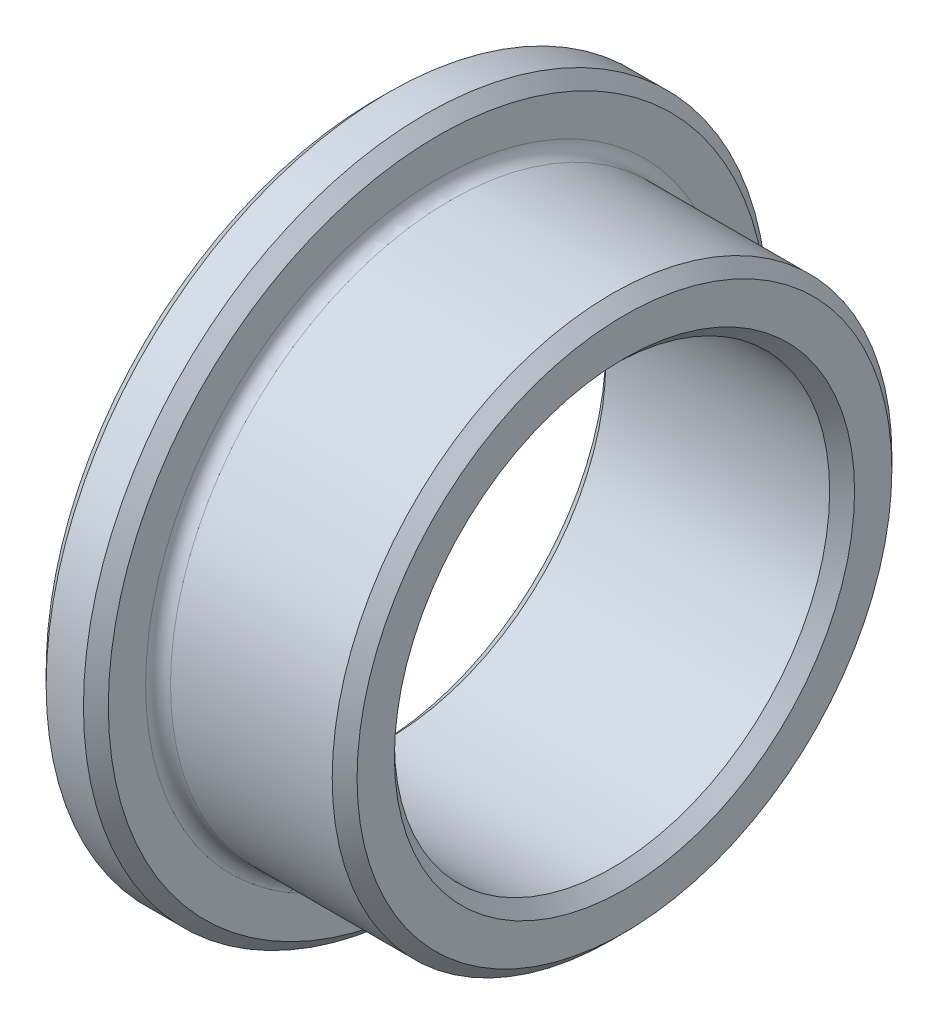
ISO-10303-21;
HEADER;
FILE_DESCRIPTION(('STEP AP214'),'2;1');
FILE_NAME('part.step','',(''),(''),'','','');
FILE_SCHEMA(('AUTOMOTIVE_DESIGN { 1 0 10303 214 1 1 1 1 }'));
ENDSEC;
DATA;
#1=APPLICATION_CONTEXT('core data for automotive mechanical design processes');
#2=APPLICATION_PROTOCOL_DEFINITION('international standard','automotive_design',2000,#1);
#3=PRODUCT_CONTEXT('',#1,'mechanical');
#4=PRODUCT('Part','Part','',(#3));
#5=PRODUCT_RELATED_PRODUCT_CATEGORY('part','',(#4));
#6=PRODUCT_DEFINITION_FORMATION('','',#4);
#7=PRODUCT_DEFINITION_CONTEXT('part definition',#1,'design');
#8=PRODUCT_DEFINITION('design','',#6,#7);
#9=PRODUCT_DEFINITION_SHAPE('','',#8);
#10=(LENGTH_UNIT() NAMED_UNIT(*) SI_UNIT(.MILLI.,.METRE.));
#11=(NAMED_UNIT(*) PLANE_ANGLE_UNIT() SI_UNIT($,.RADIAN.));
#12=(NAMED_UNIT(*) SI_UNIT($,.STERADIAN.) SOLID_ANGLE_UNIT());
#13=UNCERTAINTY_MEASURE_WITH_UNIT(LENGTH_MEASURE(1.E-05),#10,'distance_accuracy_value','');
#14=(GEOMETRIC_REPRESENTATION_CONTEXT(3) GLOBAL_UNCERTAINTY_ASSIGNED_CONTEXT((#13)) GLOBAL_UNIT_ASSIGNED_CONTEXT((#10,
#11,#12)) REPRESENTATION_CONTEXT('',''));
#15=CARTESIAN_POINT('',(0.,0.,0.));
#16=DIRECTION('',(0.,0.,1.));
#17=DIRECTION('',(1.,0.,0.));
#18=AXIS2_PLACEMENT_3D('',#15,#16,#17);
#19=CARTESIAN_POINT('',(0.,27.5,0.));
#20=DIRECTION('',(1.,0.,0.));
#21=DIRECTION('',(0.,0.,-1.));
#22=AXIS2_PLACEMENT_3D('',#19,#20,#21);
#23=PLANE('',#22);
#24=CARTESIAN_POINT('',(0.,0.,0.));
#25=DIRECTION('',(1.,0.,0.));
#26=DIRECTION('',(0.,0.,-1.));
#27=AXIS2_PLACEMENT_3D('',#24,#25,#26);
#28=CIRCLE('',#27,18.5);
#29=CARTESIAN_POINT('',(0.,0.,-18.5));
#30=VERTEX_POINT('',#29);
#31=EDGE_CURVE('E63',#30,#30,#28,.T.);
#32=ORIENTED_EDGE('',*,*,#31,.T.);
#33=EDGE_LOOP('',(#32));
#34=FACE_BOUND('',#33,.T.);
#35=CARTESIAN_POINT('',(0.,0.,0.));
#36=DIRECTION('',(1.,0.,0.));
#37=DIRECTION('',(0.,0.,-1.));
#38=AXIS2_PLACEMENT_3D('',#35,#36,#37);
#39=CIRCLE('',#38,26.5);
#40=CARTESIAN_POINT('',(0.,0.,-26.5));
#41=VERTEX_POINT('',#40);
#42=EDGE_CURVE('E66',#41,#41,#39,.F.);
#43=ORIENTED_EDGE('',*,*,#42,.T.);
#44=EDGE_LOOP('',(#43));
#45=FACE_BOUND('',#44,.T.);
#46=ADVANCED_FACE('F31',(#34,#45),#23,.F.);
#47=CARTESIAN_POINT('',(0.,0.,0.));
#48=DIRECTION('',(-1.,0.,0.));
#49=DIRECTION('',(0.,0.,1.));
#50=AXIS2_PLACEMENT_3D('',#47,#48,#49);
#51=CYLINDRICAL_SURFACE('',#50,17.5);
#52=CARTESIAN_POINT('',(1.00000000000002,0.,0.));
#53=DIRECTION('',(1.,0.,0.));
#54=DIRECTION('',(0.,0.,-1.));
#55=AXIS2_PLACEMENT_3D('',#52,#53,#54);
#56=CIRCLE('',#55,17.5);
#57=CARTESIAN_POINT('',(1.00000000000002,0.,-17.5));
#58=VERTEX_POINT('',#57);
#59=EDGE_CURVE('E69',#58,#58,#56,.F.);
#60=ORIENTED_EDGE('',*,*,#59,.T.);
#61=EDGE_LOOP('',(#60));
#62=FACE_BOUND('',#61,.T.);
#63=CARTESIAN_POINT('',(19.,0.,0.));
#64=DIRECTION('',(-1.,0.,0.));
#65=DIRECTION('',(0.,0.,1.));
#66=AXIS2_PLACEMENT_3D('',#63,#64,#65);
#67=CIRCLE('',#66,17.5);
#68=CARTESIAN_POINT('',(19.,0.,17.5));
#69=VERTEX_POINT('',#68);
#70=EDGE_CURVE('E72',#69,#69,#67,.F.);
#71=ORIENTED_EDGE('',*,*,#70,.T.);
#72=EDGE_LOOP('',(#71));
#73=FACE_BOUND('',#72,.T.);
#74=ADVANCED_FACE('F76',(#62,#73),#51,.F.);
#75=CARTESIAN_POINT('',(20.,17.5,0.));
#76=DIRECTION('',(-1.,0.,0.));
#77=DIRECTION('',(0.,0.,1.));
#78=AXIS2_PLACEMENT_3D('',#75,#76,#77);
#79=PLANE('',#78);
#80=CARTESIAN_POINT('',(20.,0.,0.));
#81=DIRECTION('',(-1.,0.,0.));
#82=DIRECTION('',(0.,0.,1.));
#83=AXIS2_PLACEMENT_3D('',#80,#81,#82);
#84=CIRCLE('',#83,18.5);
#85=CARTESIAN_POINT('',(20.,0.,18.5));
#86=VERTEX_POINT('',#85);
#87=EDGE_CURVE('E57',#86,#86,#84,.T.);
#88=ORIENTED_EDGE('',*,*,#87,.T.);
#89=EDGE_LOOP('',(#88));
#90=FACE_BOUND('',#89,.T.);
#91=CARTESIAN_POINT('',(20.,0.,0.));
#92=DIRECTION('',(-1.,0.,0.));
#93=DIRECTION('',(0.,0.,1.));
#94=AXIS2_PLACEMENT_3D('',#91,#92,#93);
#95=CIRCLE('',#94,21.5);
#96=CARTESIAN_POINT('',(20.,0.,21.5));
#97=VERTEX_POINT('',#96);
#98=EDGE_CURVE('E60',#97,#97,#95,.F.);
#99=ORIENTED_EDGE('',*,*,#98,.T.);
#100=EDGE_LOOP('',(#99));
#101=FACE_BOUND('',#100,.T.);
#102=ADVANCED_FACE('F86',(#90,#101),#79,.F.);
#103=CARTESIAN_POINT('',(0.,0.,0.));
#104=DIRECTION('',(-1.,0.,0.));
#105=DIRECTION('',(0.,0.,1.));
#106=AXIS2_PLACEMENT_3D('',#103,#104,#105);
#107=CYLINDRICAL_SURFACE('',#106,22.5);
#108=CARTESIAN_POINT('',(6.,0.,0.));
#109=DIRECTION('',(-1.,0.,0.));
#110=DIRECTION('',(0.,0.,1.));
#111=AXIS2_PLACEMENT_3D('',#108,#109,#110);
#112=CIRCLE('',#111,22.5);
#113=CARTESIAN_POINT('',(6.,0.,22.5));
#114=VERTEX_POINT('',#113);
#115=EDGE_CURVE('E10',#114,#114,#112,.F.);
#116=ORIENTED_EDGE('',*,*,#115,.T.);
#117=EDGE_LOOP('',(#116));
#118=FACE_BOUND('',#117,.T.);
#119=CARTESIAN_POINT('',(19.,0.,0.));
#120=DIRECTION('',(-1.,0.,0.));
#121=DIRECTION('',(0.,0.,1.));
#122=AXIS2_PLACEMENT_3D('',#119,#120,#121);
#123=CIRCLE('',#122,22.5);
#124=CARTESIAN_POINT('',(19.,0.,22.5));
#125=VERTEX_POINT('',#124);
#126=EDGE_CURVE('E42',#125,#125,#123,.T.);
#127=ORIENTED_EDGE('',*,*,#126,.T.);
#128=EDGE_LOOP('',(#127));
#129=FACE_BOUND('',#128,.T.);
#130=ADVANCED_FACE('F89',(#118,#129),#107,.T.);
#131=CARTESIAN_POINT('',(5.,22.5,0.));
#132=DIRECTION('',(-1.,0.,0.));
#133=DIRECTION('',(0.,0.,1.));
#134=AXIS2_PLACEMENT_3D('',#131,#132,#133);
#135=PLANE('',#134);
#136=CARTESIAN_POINT('',(5.,0.,0.));
#137=DIRECTION('',(-1.,0.,0.));
#138=DIRECTION('',(0.,0.,1.));
#139=AXIS2_PLACEMENT_3D('',#136,#137,#138);
#140=CIRCLE('',#139,23.5);
#141=CARTESIAN_POINT('',(5.,0.,23.5));
#142=VERTEX_POINT('',#141);
#143=EDGE_CURVE('E38',#142,#142,#140,.T.);
#144=ORIENTED_EDGE('',*,*,#143,.T.);
#145=EDGE_LOOP('',(#144));
#146=FACE_BOUND('',#145,.T.);
#147=CARTESIAN_POINT('',(5.,0.,0.));
#148=DIRECTION('',(-1.,0.,0.));
#149=DIRECTION('',(0.,0.,1.));
#150=AXIS2_PLACEMENT_3D('',#147,#148,#149);
#151=CIRCLE('',#150,26.5);
#152=CARTESIAN_POINT('',(5.,0.,26.5));
#153=VERTEX_POINT('',#152);
#154=EDGE_CURVE('E46',#153,#153,#151,.F.);
#155=ORIENTED_EDGE('',*,*,#154,.T.);
#156=EDGE_LOOP('',(#155));
#157=FACE_BOUND('',#156,.T.);
#158=ADVANCED_FACE('F100',(#146,#157),#135,.F.);
#159=CARTESIAN_POINT('',(0.,0.,0.));
#160=DIRECTION('',(-1.,0.,0.));
#161=DIRECTION('',(0.,0.,1.));
#162=AXIS2_PLACEMENT_3D('',#159,#160,#161);
#163=CYLINDRICAL_SURFACE('',#162,27.5);
#164=CARTESIAN_POINT('',(3.99999999999999,0.,0.));
#165=DIRECTION('',(-1.,0.,0.));
#166=DIRECTION('',(0.,0.,1.));
#167=AXIS2_PLACEMENT_3D('',#164,#165,#166);
#168=CIRCLE('',#167,27.5);
#169=CARTESIAN_POINT('',(3.99999999999999,0.,27.5));
#170=VERTEX_POINT('',#169);
#171=EDGE_CURVE('E51',#170,#170,#168,.T.);
#172=ORIENTED_EDGE('',*,*,#171,.T.);
#173=EDGE_LOOP('',(#172));
#174=FACE_BOUND('',#173,.T.);
#175=CARTESIAN_POINT('',(1.,0.,0.));
#176=DIRECTION('',(1.,0.,0.));
#177=DIRECTION('',(0.,0.,-1.));
#178=AXIS2_PLACEMENT_3D('',#175,#176,#177);
#179=CIRCLE('',#178,27.5);
#180=CARTESIAN_POINT('',(1.,0.,-27.5));
#181=VERTEX_POINT('',#180);
#182=EDGE_CURVE('E54',#181,#181,#179,.T.);
#183=ORIENTED_EDGE('',*,*,#182,.T.);
#184=EDGE_LOOP('',(#183));
#185=FACE_BOUND('',#184,.T.);
#186=ADVANCED_FACE('F105',(#174,#185),#163,.T.);
#187=CARTESIAN_POINT('',(1.00000000000002,0.,0.));
#188=DIRECTION('',(-1.,0.,0.));
#189=DIRECTION('',(0.,0.,1.));
#190=AXIS2_PLACEMENT_3D('',#187,#188,#189);
#191=CONICAL_SURFACE('',#190,17.5,0.785398163397452);
#192=ORIENTED_EDGE('',*,*,#31,.F.);
#193=EDGE_LOOP('',(#192));
#194=FACE_BOUND('',#193,.T.);
#195=ORIENTED_EDGE('',*,*,#59,.F.);
#196=EDGE_LOOP('',(#195));
#197=FACE_BOUND('',#196,.T.);
#198=ADVANCED_FACE('F82',(#194,#197),#191,.F.);
#199=CARTESIAN_POINT('',(20.,0.,0.));
#200=DIRECTION('',(1.,0.,0.));
#201=DIRECTION('',(0.,0.,-1.));
#202=AXIS2_PLACEMENT_3D('',#199,#200,#201);
#203=CONICAL_SURFACE('',#202,18.5,0.785398163397452);
#204=ORIENTED_EDGE('',*,*,#70,.F.);
#205=EDGE_LOOP('',(#204));
#206=FACE_BOUND('',#205,.T.);
#207=ORIENTED_EDGE('',*,*,#87,.F.);
#208=EDGE_LOOP('',(#207));
#209=FACE_BOUND('',#208,.T.);
#210=ADVANCED_FACE('F78',(#206,#209),#203,.F.);
#211=CARTESIAN_POINT('',(3.99999999999999,0.,0.));
#212=DIRECTION('',(-1.,0.,0.));
#213=DIRECTION('',(0.,0.,1.));
#214=AXIS2_PLACEMENT_3D('',#211,#212,#213);
#215=CONICAL_SURFACE('',#214,27.5,0.785398163397448);
#216=ORIENTED_EDGE('',*,*,#154,.F.);
#217=EDGE_LOOP('',(#216));
#218=FACE_BOUND('',#217,.T.);
#219=ORIENTED_EDGE('',*,*,#171,.F.);
#220=EDGE_LOOP('',(#219));
#221=FACE_BOUND('',#220,.T.);
#222=ADVANCED_FACE('F81',(#218,#221),#215,.T.);
#223=CARTESIAN_POINT('',(0.,0.,0.));
#224=DIRECTION('',(1.,0.,0.));
#225=DIRECTION('',(0.,0.,-1.));
#226=AXIS2_PLACEMENT_3D('',#223,#224,#225);
#227=CONICAL_SURFACE('',#226,26.5,0.785398163397448);
#228=ORIENTED_EDGE('',*,*,#182,.F.);
#229=EDGE_LOOP('',(#228));
#230=FACE_BOUND('',#229,.T.);
#231=ORIENTED_EDGE('',*,*,#42,.F.);
#232=EDGE_LOOP('',(#231));
#233=FACE_BOUND('',#232,.T.);
#234=ADVANCED_FACE('F96',(#230,#233),#227,.T.);
#235=CARTESIAN_POINT('',(19.,0.,0.));
#236=DIRECTION('',(-1.,0.,0.));
#237=DIRECTION('',(0.,0.,1.));
#238=AXIS2_PLACEMENT_3D('',#235,#236,#237);
#239=CONICAL_SURFACE('',#238,22.5,0.785398163397447);
#240=ORIENTED_EDGE('',*,*,#98,.F.);
#241=EDGE_LOOP('',(#240));
#242=FACE_BOUND('',#241,.T.);
#243=ORIENTED_EDGE('',*,*,#126,.F.);
#244=EDGE_LOOP('',(#243));
#245=FACE_BOUND('',#244,.T.);
#246=ADVANCED_FACE('F93',(#242,#245),#239,.T.);
#247=CARTESIAN_POINT('',(6.,0.,0.));
#248=DIRECTION('',(-1.,0.,0.));
#249=DIRECTION('',(0.,0.,1.));
#250=AXIS2_PLACEMENT_3D('',#247,#248,#249);
#251=TOROIDAL_SURFACE('',#250,23.5,1.);
#252=ORIENTED_EDGE('',*,*,#115,.F.);
#253=EDGE_LOOP('',(#252));
#254=FACE_BOUND('',#253,.T.);
#255=ORIENTED_EDGE('',*,*,#143,.F.);
#256=EDGE_LOOP('',(#255));
#257=FACE_BOUND('',#256,.T.);
#258=ADVANCED_FACE('F33',(#254,#257),#251,.F.);
#259=CLOSED_SHELL('',(#46,#74,#102,#130,#158,#186,#198,#210,#222,#234,#246,#258));
#260=MANIFOLD_SOLID_BREP('B2',#259);
#261=ADVANCED_BREP_SHAPE_REPRESENTATION('',(#18,#260),#14);
#262=SHAPE_DEFINITION_REPRESENTATION(#9,#261);
ENDSEC;
END-ISO-10303-21;
